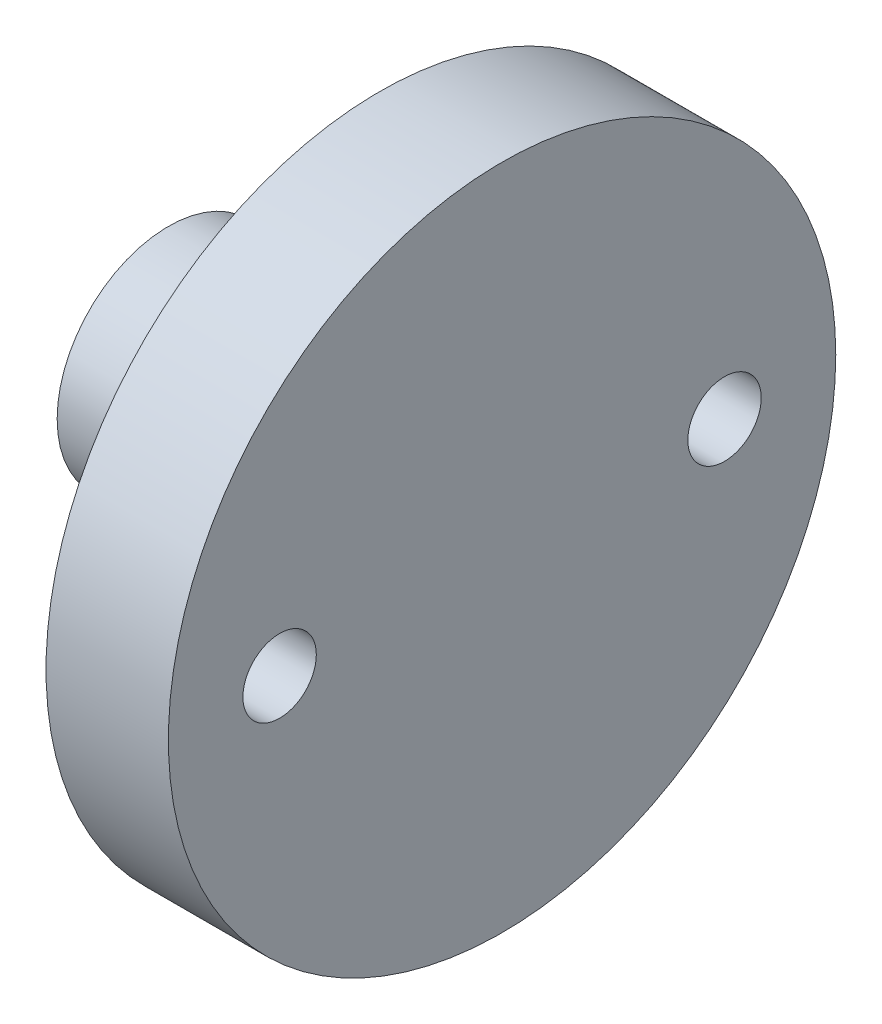
ISO-10303-21;
HEADER;
FILE_DESCRIPTION(('STEP AP214'),'2;1');
FILE_NAME('part.step','',(''),(''),'','','');
FILE_SCHEMA(('AUTOMOTIVE_DESIGN { 1 0 10303 214 1 1 1 1 }'));
ENDSEC;
DATA;
#1=APPLICATION_CONTEXT('core data for automotive mechanical design processes');
#2=APPLICATION_PROTOCOL_DEFINITION('international standard','automotive_design',2000,#1);
#3=PRODUCT_CONTEXT('',#1,'mechanical');
#4=PRODUCT('Part','Part','',(#3));
#5=PRODUCT_RELATED_PRODUCT_CATEGORY('part','',(#4));
#6=PRODUCT_DEFINITION_FORMATION('','',#4);
#7=PRODUCT_DEFINITION_CONTEXT('part definition',#1,'design');
#8=PRODUCT_DEFINITION('design','',#6,#7);
#9=PRODUCT_DEFINITION_SHAPE('','',#8);
#10=(LENGTH_UNIT() NAMED_UNIT(*) SI_UNIT(.MILLI.,.METRE.));
#11=(NAMED_UNIT(*) PLANE_ANGLE_UNIT() SI_UNIT($,.RADIAN.));
#12=(NAMED_UNIT(*) SI_UNIT($,.STERADIAN.) SOLID_ANGLE_UNIT());
#13=UNCERTAINTY_MEASURE_WITH_UNIT(LENGTH_MEASURE(1.E-05),#10,'distance_accuracy_value','');
#14=(GEOMETRIC_REPRESENTATION_CONTEXT(3) GLOBAL_UNCERTAINTY_ASSIGNED_CONTEXT((#13)) GLOBAL_UNIT_ASSIGNED_CONTEXT((#10,
#11,#12)) REPRESENTATION_CONTEXT('',''));
#15=CARTESIAN_POINT('',(0.,0.,0.));
#16=DIRECTION('',(0.,0.,1.));
#17=DIRECTION('',(1.,0.,0.));
#18=AXIS2_PLACEMENT_3D('',#15,#16,#17);
#19=CARTESIAN_POINT('',(5.5,0.,0.));
#20=DIRECTION('',(-1.,0.,0.));
#21=DIRECTION('',(0.,0.,1.));
#22=AXIS2_PLACEMENT_3D('',#19,#20,#21);
#23=CYLINDRICAL_SURFACE('',#22,15.);
#24=CARTESIAN_POINT('',(5.5,0.,0.));
#25=DIRECTION('',(1.,0.,0.));
#26=DIRECTION('',(0.,0.,-1.));
#27=AXIS2_PLACEMENT_3D('',#24,#25,#26);
#28=CIRCLE('',#27,15.);
#29=CARTESIAN_POINT('',(5.5,0.,-15.));
#30=VERTEX_POINT('',#29);
#31=EDGE_CURVE('E51',#30,#30,#28,.T.);
#32=ORIENTED_EDGE('',*,*,#31,.F.);
#33=EDGE_LOOP('',(#32));
#34=FACE_BOUND('',#33,.T.);
#35=CARTESIAN_POINT('',(0.,0.,0.));
#36=DIRECTION('',(1.,0.,0.));
#37=DIRECTION('',(0.,0.,-1.));
#38=AXIS2_PLACEMENT_3D('',#35,#36,#37);
#39=CIRCLE('',#38,15.);
#40=CARTESIAN_POINT('',(0.,0.,-15.));
#41=VERTEX_POINT('',#40);
#42=EDGE_CURVE('E60',#41,#41,#39,.T.);
#43=ORIENTED_EDGE('',*,*,#42,.T.);
#44=EDGE_LOOP('',(#43));
#45=FACE_BOUND('',#44,.T.);
#46=ADVANCED_FACE('F37',(#34,#45),#23,.T.);
#47=CARTESIAN_POINT('',(5.5,0.,0.));
#48=DIRECTION('',(1.,0.,0.));
#49=DIRECTION('',(0.,0.,-1.));
#50=AXIS2_PLACEMENT_3D('',#47,#48,#49);
#51=PLANE('',#50);
#52=CARTESIAN_POINT('',(5.5,0.,-10.));
#53=DIRECTION('',(1.,0.,0.));
#54=DIRECTION('',(0.,0.,-1.));
#55=AXIS2_PLACEMENT_3D('',#52,#53,#54);
#56=CIRCLE('',#55,1.65);
#57=CARTESIAN_POINT('',(5.5,0.,-11.65));
#58=VERTEX_POINT('',#57);
#59=EDGE_CURVE('E70',#58,#58,#56,.T.);
#60=ORIENTED_EDGE('',*,*,#59,.F.);
#61=EDGE_LOOP('',(#60));
#62=FACE_BOUND('',#61,.T.);
#63=CARTESIAN_POINT('',(5.5,0.,10.));
#64=DIRECTION('',(1.,0.,0.));
#65=DIRECTION('',(0.,0.,1.));
#66=AXIS2_PLACEMENT_3D('',#63,#64,#65);
#67=CIRCLE('',#66,1.65);
#68=CARTESIAN_POINT('',(5.5,0.,11.65));
#69=VERTEX_POINT('',#68);
#70=EDGE_CURVE('E77',#69,#69,#67,.T.);
#71=ORIENTED_EDGE('',*,*,#70,.F.);
#72=EDGE_LOOP('',(#71));
#73=FACE_BOUND('',#72,.T.);
#74=ORIENTED_EDGE('',*,*,#31,.T.);
#75=EDGE_LOOP('',(#74));
#76=FACE_BOUND('',#75,.T.);
#77=ADVANCED_FACE('F88',(#62,#73,#76),#51,.T.);
#78=CARTESIAN_POINT('',(0.,0.,0.));
#79=DIRECTION('',(1.,0.,0.));
#80=DIRECTION('',(0.,0.,-1.));
#81=AXIS2_PLACEMENT_3D('',#78,#79,#80);
#82=PLANE('',#81);
#83=CARTESIAN_POINT('',(0.,0.,-10.));
#84=DIRECTION('',(1.,0.,0.));
#85=DIRECTION('',(0.,0.,-1.));
#86=AXIS2_PLACEMENT_3D('',#83,#84,#85);
#87=CIRCLE('',#86,1.65);
#88=CARTESIAN_POINT('',(0.,0.,-11.65));
#89=VERTEX_POINT('',#88);
#90=EDGE_CURVE('E40',#89,#89,#87,.T.);
#91=ORIENTED_EDGE('',*,*,#90,.T.);
#92=EDGE_LOOP('',(#91));
#93=FACE_BOUND('',#92,.T.);
#94=CARTESIAN_POINT('',(0.,0.,10.));
#95=DIRECTION('',(1.,0.,0.));
#96=DIRECTION('',(0.,0.,-1.));
#97=AXIS2_PLACEMENT_3D('',#94,#95,#96);
#98=CIRCLE('',#97,1.65);
#99=CARTESIAN_POINT('',(0.,0.,8.35));
#100=VERTEX_POINT('',#99);
#101=EDGE_CURVE('E67',#100,#100,#98,.T.);
#102=ORIENTED_EDGE('',*,*,#101,.T.);
#103=EDGE_LOOP('',(#102));
#104=FACE_BOUND('',#103,.T.);
#105=CARTESIAN_POINT('',(0.,0.,0.));
#106=DIRECTION('',(-1.,0.,0.));
#107=DIRECTION('',(0.,0.,1.));
#108=AXIS2_PLACEMENT_3D('',#105,#106,#107);
#109=CIRCLE('',#108,6.);
#110=CARTESIAN_POINT('',(0.,0.,6.));
#111=VERTEX_POINT('',#110);
#112=EDGE_CURVE('E45',#111,#111,#109,.T.);
#113=ORIENTED_EDGE('',*,*,#112,.F.);
#114=EDGE_LOOP('',(#113));
#115=FACE_BOUND('',#114,.T.);
#116=ORIENTED_EDGE('',*,*,#42,.F.);
#117=EDGE_LOOP('',(#116));
#118=FACE_BOUND('',#117,.T.);
#119=ADVANCED_FACE('F91',(#93,#104,#115,#118),#82,.F.);
#120=CARTESIAN_POINT('',(-2.,0.,0.));
#121=DIRECTION('',(1.,0.,0.));
#122=DIRECTION('',(0.,0.,-1.));
#123=AXIS2_PLACEMENT_3D('',#120,#121,#122);
#124=CYLINDRICAL_SURFACE('',#123,6.);
#125=CARTESIAN_POINT('',(-2.,0.,0.));
#126=DIRECTION('',(-1.,0.,0.));
#127=DIRECTION('',(0.,0.,1.));
#128=AXIS2_PLACEMENT_3D('',#125,#126,#127);
#129=CIRCLE('',#128,6.);
#130=CARTESIAN_POINT('',(-2.,0.,6.));
#131=VERTEX_POINT('',#130);
#132=EDGE_CURVE('E57',#131,#131,#129,.T.);
#133=ORIENTED_EDGE('',*,*,#132,.F.);
#134=EDGE_LOOP('',(#133));
#135=FACE_BOUND('',#134,.T.);
#136=ORIENTED_EDGE('',*,*,#112,.T.);
#137=EDGE_LOOP('',(#136));
#138=FACE_BOUND('',#137,.T.);
#139=ADVANCED_FACE('F101',(#135,#138),#124,.T.);
#140=CARTESIAN_POINT('',(-2.,0.,0.));
#141=DIRECTION('',(-1.,0.,0.));
#142=DIRECTION('',(0.,0.,1.));
#143=AXIS2_PLACEMENT_3D('',#140,#141,#142);
#144=PLANE('',#143);
#145=CARTESIAN_POINT('',(-2.,0.,0.));
#146=DIRECTION('',(-1.,0.,0.));
#147=DIRECTION('',(0.,0.,1.));
#148=AXIS2_PLACEMENT_3D('',#145,#146,#147);
#149=CIRCLE('',#148,5.);
#150=CARTESIAN_POINT('',(-2.,0.,5.));
#151=VERTEX_POINT('',#150);
#152=EDGE_CURVE('E10',#151,#151,#149,.T.);
#153=ORIENTED_EDGE('',*,*,#152,.F.);
#154=EDGE_LOOP('',(#153));
#155=FACE_BOUND('',#154,.T.);
#156=ORIENTED_EDGE('',*,*,#132,.T.);
#157=EDGE_LOOP('',(#156));
#158=FACE_BOUND('',#157,.T.);
#159=ADVANCED_FACE('F106',(#155,#158),#144,.T.);
#160=CARTESIAN_POINT('',(-9.5,0.,0.));
#161=DIRECTION('',(1.,0.,0.));
#162=DIRECTION('',(0.,0.,-1.));
#163=AXIS2_PLACEMENT_3D('',#160,#161,#162);
#164=CYLINDRICAL_SURFACE('',#163,5.);
#165=CARTESIAN_POINT('',(-9.5,0.,0.));
#166=DIRECTION('',(-1.,0.,0.));
#167=DIRECTION('',(0.,0.,1.));
#168=AXIS2_PLACEMENT_3D('',#165,#166,#167);
#169=CIRCLE('',#168,5.);
#170=CARTESIAN_POINT('',(-9.5,0.,5.));
#171=VERTEX_POINT('',#170);
#172=EDGE_CURVE('E55',#171,#171,#169,.T.);
#173=ORIENTED_EDGE('',*,*,#172,.F.);
#174=EDGE_LOOP('',(#173));
#175=FACE_BOUND('',#174,.T.);
#176=ORIENTED_EDGE('',*,*,#152,.T.);
#177=EDGE_LOOP('',(#176));
#178=FACE_BOUND('',#177,.T.);
#179=ADVANCED_FACE('F112',(#175,#178),#164,.T.);
#180=CARTESIAN_POINT('',(-9.5,0.,0.));
#181=DIRECTION('',(-1.,0.,0.));
#182=DIRECTION('',(0.,0.,1.));
#183=AXIS2_PLACEMENT_3D('',#180,#181,#182);
#184=PLANE('',#183);
#185=ORIENTED_EDGE('',*,*,#172,.T.);
#186=EDGE_LOOP('',(#185));
#187=FACE_BOUND('',#186,.T.);
#188=ADVANCED_FACE('F116',(#187),#184,.T.);
#189=CARTESIAN_POINT('',(-9.5,0.,10.));
#190=DIRECTION('',(1.,0.,0.));
#191=DIRECTION('',(0.,0.,-1.));
#192=AXIS2_PLACEMENT_3D('',#189,#190,#191);
#193=CYLINDRICAL_SURFACE('',#192,1.65);
#194=ORIENTED_EDGE('',*,*,#70,.T.);
#195=EDGE_LOOP('',(#194));
#196=FACE_BOUND('',#195,.T.);
#197=ORIENTED_EDGE('',*,*,#101,.F.);
#198=EDGE_LOOP('',(#197));
#199=FACE_BOUND('',#198,.T.);
#200=ADVANCED_FACE('F85',(#196,#199),#193,.F.);
#201=CARTESIAN_POINT('',(-9.5,0.,-10.));
#202=DIRECTION('',(1.,0.,0.));
#203=DIRECTION('',(0.,0.,-1.));
#204=AXIS2_PLACEMENT_3D('',#201,#202,#203);
#205=CYLINDRICAL_SURFACE('',#204,1.65);
#206=ORIENTED_EDGE('',*,*,#59,.T.);
#207=EDGE_LOOP('',(#206));
#208=FACE_BOUND('',#207,.T.);
#209=ORIENTED_EDGE('',*,*,#90,.F.);
#210=EDGE_LOOP('',(#209));
#211=FACE_BOUND('',#210,.T.);
#212=ADVANCED_FACE('F123',(#208,#211),#205,.F.);
#213=CLOSED_SHELL('',(#46,#77,#119,#139,#159,#179,#188,#200,#212));
#214=MANIFOLD_SOLID_BREP('B2',#213);
#215=ADVANCED_BREP_SHAPE_REPRESENTATION('',(#18,#214),#14);
#216=SHAPE_DEFINITION_REPRESENTATION(#9,#215);
ENDSEC;
END-ISO-10303-21;
